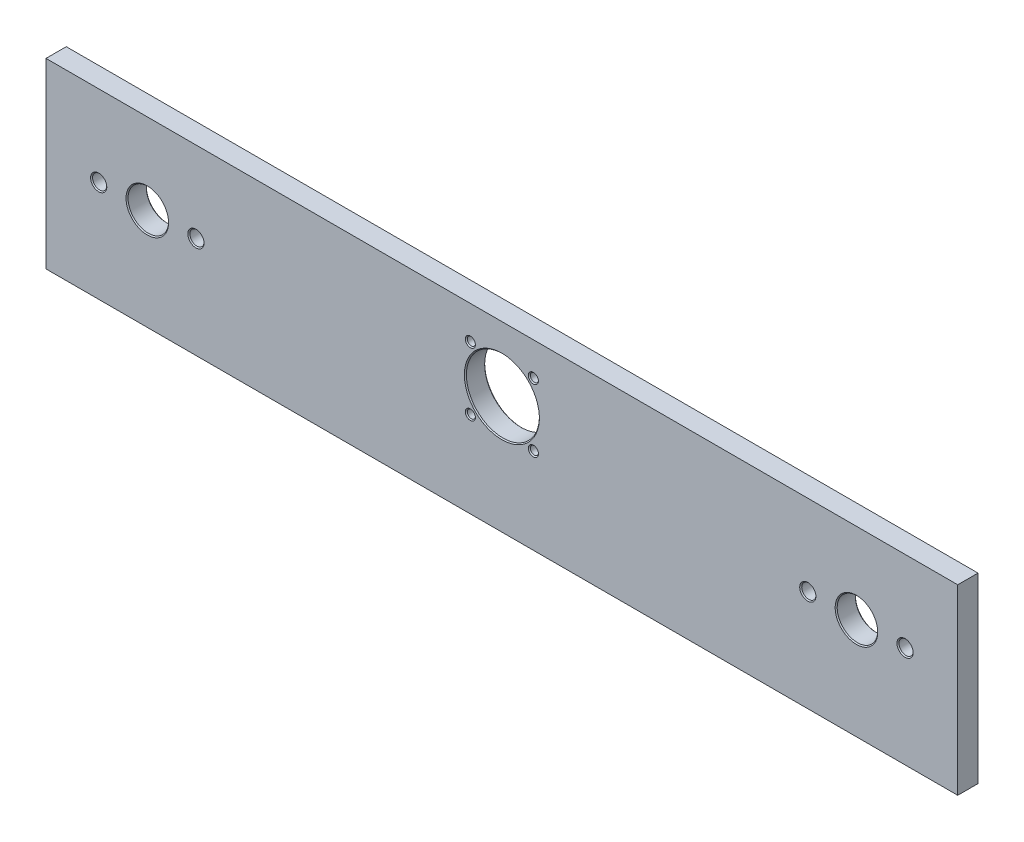
ISO-10303-21;
HEADER;
FILE_DESCRIPTION(('STEP AP214'),'2;1');
FILE_NAME('part.step','',(''),(''),'','','');
FILE_SCHEMA(('AUTOMOTIVE_DESIGN { 1 0 10303 214 1 1 1 1 }'));
ENDSEC;
DATA;
#1=APPLICATION_CONTEXT('core data for automotive mechanical design processes');
#2=APPLICATION_PROTOCOL_DEFINITION('international standard','automotive_design',2000,#1);
#3=PRODUCT_CONTEXT('',#1,'mechanical');
#4=PRODUCT('Part','Part','',(#3));
#5=PRODUCT_RELATED_PRODUCT_CATEGORY('part','',(#4));
#6=PRODUCT_DEFINITION_FORMATION('','',#4);
#7=PRODUCT_DEFINITION_CONTEXT('part definition',#1,'design');
#8=PRODUCT_DEFINITION('design','',#6,#7);
#9=PRODUCT_DEFINITION_SHAPE('','',#8);
#10=(LENGTH_UNIT() NAMED_UNIT(*) SI_UNIT(.MILLI.,.METRE.));
#11=(NAMED_UNIT(*) PLANE_ANGLE_UNIT() SI_UNIT($,.RADIAN.));
#12=(NAMED_UNIT(*) SI_UNIT($,.STERADIAN.) SOLID_ANGLE_UNIT());
#13=UNCERTAINTY_MEASURE_WITH_UNIT(LENGTH_MEASURE(1.E-05),#10,'distance_accuracy_value','');
#14=(GEOMETRIC_REPRESENTATION_CONTEXT(3) GLOBAL_UNCERTAINTY_ASSIGNED_CONTEXT((#13)) GLOBAL_UNIT_ASSIGNED_CONTEXT((#10,
#11,#12)) REPRESENTATION_CONTEXT('',''));
#15=CARTESIAN_POINT('',(0.,0.,0.));
#16=DIRECTION('',(0.,0.,1.));
#17=DIRECTION('',(1.,0.,0.));
#18=AXIS2_PLACEMENT_3D('',#15,#16,#17);
#19=CARTESIAN_POINT('',(0.,0.,10.));
#20=DIRECTION('',(1.,0.,0.));
#21=DIRECTION('',(0.,1.,0.));
#22=AXIS2_PLACEMENT_3D('',#19,#20,#21);
#23=PLANE('',#22);
#24=DIRECTION('',(0.,-1.,0.));
#25=VECTOR('',#24,1.);
#26=CARTESIAN_POINT('',(0.,0.,0.));
#27=LINE('',#26,#25);
#28=CARTESIAN_POINT('',(0.,89.9999999999999,0.));
#29=VERTEX_POINT('',#28);
#30=CARTESIAN_POINT('',(0.,0.,0.));
#31=VERTEX_POINT('',#30);
#32=EDGE_CURVE('E100',#29,#31,#27,.T.);
#33=ORIENTED_EDGE('',*,*,#32,.T.);
#34=DIRECTION('',(0.,0.,-1.));
#35=VECTOR('',#34,1.);
#36=CARTESIAN_POINT('',(0.,0.,10.));
#37=LINE('',#36,#35);
#38=CARTESIAN_POINT('',(0.,0.,10.));
#39=VERTEX_POINT('',#38);
#40=EDGE_CURVE('E91',#39,#31,#37,.T.);
#41=ORIENTED_EDGE('',*,*,#40,.F.);
#42=DIRECTION('',(0.,-1.,0.));
#43=VECTOR('',#42,1.);
#44=CARTESIAN_POINT('',(0.,0.,10.));
#45=LINE('',#44,#43);
#46=CARTESIAN_POINT('',(0.,89.9999999999999,10.));
#47=VERTEX_POINT('',#46);
#48=EDGE_CURVE('E85',#47,#39,#45,.T.);
#49=ORIENTED_EDGE('',*,*,#48,.F.);
#50=DIRECTION('',(0.,0.,-1.));
#51=VECTOR('',#50,1.);
#52=CARTESIAN_POINT('',(0.,89.9999999999999,10.));
#53=LINE('',#52,#51);
#54=EDGE_CURVE('E96',#47,#29,#53,.T.);
#55=ORIENTED_EDGE('',*,*,#54,.T.);
#56=EDGE_LOOP('',(#33,#41,#49,#55));
#57=FACE_BOUND('',#56,.T.);
#58=ADVANCED_FACE('F32',(#57),#23,.F.);
#59=CARTESIAN_POINT('',(0.,0.,10.));
#60=DIRECTION('',(0.,1.,0.));
#61=DIRECTION('',(-1.,0.,0.));
#62=AXIS2_PLACEMENT_3D('',#59,#60,#61);
#63=PLANE('',#62);
#64=DIRECTION('',(1.,0.,0.));
#65=VECTOR('',#64,1.);
#66=CARTESIAN_POINT('',(0.,0.,0.));
#67=LINE('',#66,#65);
#68=CARTESIAN_POINT('',(450.,0.,0.));
#69=VERTEX_POINT('',#68);
#70=EDGE_CURVE('E90',#31,#69,#67,.T.);
#71=ORIENTED_EDGE('',*,*,#70,.T.);
#72=DIRECTION('',(0.,0.,-1.));
#73=VECTOR('',#72,1.);
#74=CARTESIAN_POINT('',(450.,0.,10.));
#75=LINE('',#74,#73);
#76=CARTESIAN_POINT('',(450.,0.,10.));
#77=VERTEX_POINT('',#76);
#78=EDGE_CURVE('E88',#77,#69,#75,.T.);
#79=ORIENTED_EDGE('',*,*,#78,.F.);
#80=DIRECTION('',(1.,0.,0.));
#81=VECTOR('',#80,1.);
#82=CARTESIAN_POINT('',(0.,0.,10.));
#83=LINE('',#82,#81);
#84=EDGE_CURVE('E80',#39,#77,#83,.T.);
#85=ORIENTED_EDGE('',*,*,#84,.F.);
#86=ORIENTED_EDGE('',*,*,#40,.T.);
#87=EDGE_LOOP('',(#71,#79,#85,#86));
#88=FACE_BOUND('',#87,.T.);
#89=ADVANCED_FACE('F89',(#88),#63,.F.);
#90=CARTESIAN_POINT('',(450.,0.,10.));
#91=DIRECTION('',(-1.,0.,0.));
#92=DIRECTION('',(0.,-1.,0.));
#93=AXIS2_PLACEMENT_3D('',#90,#91,#92);
#94=PLANE('',#93);
#95=DIRECTION('',(0.,1.,0.));
#96=VECTOR('',#95,1.);
#97=CARTESIAN_POINT('',(450.,0.,0.));
#98=LINE('',#97,#96);
#99=CARTESIAN_POINT('',(450.,90.0000000000001,0.));
#100=VERTEX_POINT('',#99);
#101=EDGE_CURVE('E66',#69,#100,#98,.T.);
#102=ORIENTED_EDGE('',*,*,#101,.T.);
#103=DIRECTION('',(0.,0.,-1.));
#104=VECTOR('',#103,1.);
#105=CARTESIAN_POINT('',(450.,90.0000000000001,10.));
#106=LINE('',#105,#104);
#107=CARTESIAN_POINT('',(450.,90.0000000000001,10.));
#108=VERTEX_POINT('',#107);
#109=EDGE_CURVE('E92',#108,#100,#106,.T.);
#110=ORIENTED_EDGE('',*,*,#109,.F.);
#111=DIRECTION('',(0.,1.,0.));
#112=VECTOR('',#111,1.);
#113=CARTESIAN_POINT('',(450.,0.,10.));
#114=LINE('',#113,#112);
#115=EDGE_CURVE('E83',#77,#108,#114,.T.);
#116=ORIENTED_EDGE('',*,*,#115,.F.);
#117=ORIENTED_EDGE('',*,*,#78,.T.);
#118=EDGE_LOOP('',(#102,#110,#116,#117));
#119=FACE_BOUND('',#118,.T.);
#120=ADVANCED_FACE('F94',(#119),#94,.F.);
#121=CARTESIAN_POINT('',(0.,89.9999999999999,10.));
#122=DIRECTION('',(0.,-1.,0.));
#123=DIRECTION('',(1.,0.,0.));
#124=AXIS2_PLACEMENT_3D('',#121,#122,#123);
#125=PLANE('',#124);
#126=DIRECTION('',(-1.,0.,0.));
#127=VECTOR('',#126,1.);
#128=CARTESIAN_POINT('',(0.,89.9999999999999,0.));
#129=LINE('',#128,#127);
#130=EDGE_CURVE('E72',#100,#29,#129,.T.);
#131=ORIENTED_EDGE('',*,*,#130,.T.);
#132=ORIENTED_EDGE('',*,*,#54,.F.);
#133=DIRECTION('',(-1.,0.,0.));
#134=VECTOR('',#133,1.);
#135=CARTESIAN_POINT('',(0.,89.9999999999999,10.));
#136=LINE('',#135,#134);
#137=EDGE_CURVE('E49',#108,#47,#136,.T.);
#138=ORIENTED_EDGE('',*,*,#137,.F.);
#139=ORIENTED_EDGE('',*,*,#109,.T.);
#140=EDGE_LOOP('',(#131,#132,#138,#139));
#141=FACE_BOUND('',#140,.T.);
#142=ADVANCED_FACE('F361',(#141),#125,.F.);
#143=CARTESIAN_POINT('',(0.,0.,10.));
#144=DIRECTION('',(0.,0.,-1.));
#145=DIRECTION('',(-1.,0.,0.));
#146=AXIS2_PLACEMENT_3D('',#143,#144,#145);
#147=PLANE('',#146);
#148=CARTESIAN_POINT('',(424.,50.,10.));
#149=DIRECTION('',(0.,0.,-1.));
#150=DIRECTION('',(-1.,0.,0.));
#151=AXIS2_PLACEMENT_3D('',#148,#149,#150);
#152=CIRCLE('',#151,3.99999999999989);
#153=CARTESIAN_POINT('',(420.,50.,10.));
#154=VERTEX_POINT('',#153);
#155=EDGE_CURVE('E11',#154,#154,#152,.T.);
#156=ORIENTED_EDGE('',*,*,#155,.T.);
#157=EDGE_LOOP('',(#156));
#158=FACE_BOUND('',#157,.T.);
#159=CARTESIAN_POINT('',(400.,50.,10.));
#160=DIRECTION('',(0.,0.,-1.));
#161=DIRECTION('',(-1.,0.,0.));
#162=AXIS2_PLACEMENT_3D('',#159,#160,#161);
#163=CIRCLE('',#162,10.5000000000001);
#164=CARTESIAN_POINT('',(389.5,50.,10.));
#165=VERTEX_POINT('',#164);
#166=EDGE_CURVE('E41',#165,#165,#163,.T.);
#167=ORIENTED_EDGE('',*,*,#166,.T.);
#168=EDGE_LOOP('',(#167));
#169=FACE_BOUND('',#168,.T.);
#170=CARTESIAN_POINT('',(376.,50.,10.));
#171=DIRECTION('',(0.,0.,-1.));
#172=DIRECTION('',(-1.,0.,0.));
#173=AXIS2_PLACEMENT_3D('',#170,#171,#172);
#174=CIRCLE('',#173,3.99999999999989);
#175=CARTESIAN_POINT('',(372.,50.,10.));
#176=VERTEX_POINT('',#175);
#177=EDGE_CURVE('E232',#176,#176,#174,.T.);
#178=ORIENTED_EDGE('',*,*,#177,.T.);
#179=EDGE_LOOP('',(#178));
#180=FACE_BOUND('',#179,.T.);
#181=CARTESIAN_POINT('',(74.,49.9999999999999,10.));
#182=DIRECTION('',(0.,0.,-1.));
#183=DIRECTION('',(-1.,0.,0.));
#184=AXIS2_PLACEMENT_3D('',#181,#182,#183);
#185=CIRCLE('',#184,4.00000000000006);
#186=CARTESIAN_POINT('',(70.,49.9999999999999,10.));
#187=VERTEX_POINT('',#186);
#188=EDGE_CURVE('E229',#187,#187,#185,.T.);
#189=ORIENTED_EDGE('',*,*,#188,.T.);
#190=EDGE_LOOP('',(#189));
#191=FACE_BOUND('',#190,.T.);
#192=CARTESIAN_POINT('',(50.,49.9999999999999,10.));
#193=DIRECTION('',(0.,0.,-1.));
#194=DIRECTION('',(-1.,0.,0.));
#195=AXIS2_PLACEMENT_3D('',#192,#193,#194);
#196=CIRCLE('',#195,10.5000000000001);
#197=CARTESIAN_POINT('',(39.5,49.9999999999999,10.));
#198=VERTEX_POINT('',#197);
#199=EDGE_CURVE('E226',#198,#198,#196,.T.);
#200=ORIENTED_EDGE('',*,*,#199,.T.);
#201=EDGE_LOOP('',(#200));
#202=FACE_BOUND('',#201,.T.);
#203=CARTESIAN_POINT('',(26.,49.9999999999999,10.));
#204=DIRECTION('',(0.,0.,-1.));
#205=DIRECTION('',(-1.,0.,0.));
#206=AXIS2_PLACEMENT_3D('',#203,#204,#205);
#207=CIRCLE('',#206,4.00000000000006);
#208=CARTESIAN_POINT('',(22.,49.9999999999999,10.));
#209=VERTEX_POINT('',#208);
#210=EDGE_CURVE('E223',#209,#209,#207,.T.);
#211=ORIENTED_EDGE('',*,*,#210,.T.);
#212=EDGE_LOOP('',(#211));
#213=FACE_BOUND('',#212,.T.);
#214=CARTESIAN_POINT('',(240.562232823002,42.4495366769125,10.));
#215=DIRECTION('',(0.,0.,-1.));
#216=DIRECTION('',(-1.,0.,0.));
#217=AXIS2_PLACEMENT_3D('',#214,#215,#216);
#218=CIRCLE('',#217,2.5);
#219=CARTESIAN_POINT('',(238.062232823002,42.4495366769125,10.));
#220=VERTEX_POINT('',#219);
#221=EDGE_CURVE('E160',#220,#220,#218,.T.);
#222=ORIENTED_EDGE('',*,*,#221,.T.);
#223=EDGE_LOOP('',(#222));
#224=FACE_BOUND('',#223,.T.);
#225=CARTESIAN_POINT('',(209.449536676913,42.4377671769982,10.));
#226=DIRECTION('',(0.,0.,-1.));
#227=DIRECTION('',(-1.,0.,0.));
#228=AXIS2_PLACEMENT_3D('',#225,#226,#227);
#229=CIRCLE('',#228,2.5);
#230=CARTESIAN_POINT('',(206.949536676913,42.4377671769982,10.));
#231=VERTEX_POINT('',#230);
#232=EDGE_CURVE('E157',#231,#231,#229,.T.);
#233=ORIENTED_EDGE('',*,*,#232,.T.);
#234=EDGE_LOOP('',(#233));
#235=FACE_BOUND('',#234,.T.);
#236=CARTESIAN_POINT('',(240.550463323087,73.5622328230016,10.));
#237=DIRECTION('',(0.,0.,-1.));
#238=DIRECTION('',(-1.,0.,0.));
#239=AXIS2_PLACEMENT_3D('',#236,#237,#238);
#240=CIRCLE('',#239,2.5);
#241=CARTESIAN_POINT('',(238.050463323087,73.5622328230016,10.));
#242=VERTEX_POINT('',#241);
#243=EDGE_CURVE('E154',#242,#242,#240,.T.);
#244=ORIENTED_EDGE('',*,*,#243,.T.);
#245=EDGE_LOOP('',(#244));
#246=FACE_BOUND('',#245,.T.);
#247=CARTESIAN_POINT('',(209.437767176998,73.5504633230874,10.));
#248=DIRECTION('',(0.,0.,-1.));
#249=DIRECTION('',(-1.,0.,0.));
#250=AXIS2_PLACEMENT_3D('',#247,#248,#249);
#251=CIRCLE('',#250,2.5);
#252=CARTESIAN_POINT('',(206.937767176998,73.5504633230874,10.));
#253=VERTEX_POINT('',#252);
#254=EDGE_CURVE('E151',#253,#253,#251,.T.);
#255=ORIENTED_EDGE('',*,*,#254,.T.);
#256=EDGE_LOOP('',(#255));
#257=FACE_BOUND('',#256,.T.);
#258=CARTESIAN_POINT('',(225.,57.9999999999999,10.));
#259=DIRECTION('',(0.,0.,-1.));
#260=DIRECTION('',(-1.,0.,0.));
#261=AXIS2_PLACEMENT_3D('',#258,#259,#260);
#262=CIRCLE('',#261,18.5000000000001);
#263=CARTESIAN_POINT('',(206.5,57.9999999999999,10.));
#264=VERTEX_POINT('',#263);
#265=EDGE_CURVE('E148',#264,#264,#262,.T.);
#266=ORIENTED_EDGE('',*,*,#265,.T.);
#267=EDGE_LOOP('',(#266));
#268=FACE_BOUND('',#267,.T.);
#269=ORIENTED_EDGE('',*,*,#48,.T.);
#270=ORIENTED_EDGE('',*,*,#84,.T.);
#271=ORIENTED_EDGE('',*,*,#115,.T.);
#272=ORIENTED_EDGE('',*,*,#137,.T.);
#273=EDGE_LOOP('',(#269,#270,#271,#272));
#274=FACE_BOUND('',#273,.T.);
#275=ADVANCED_FACE('F81',(#158,#169,#180,#191,#202,#213,#224,#235,#246,#257,#268,#274),#147,.F.);
#276=CARTESIAN_POINT('',(0.,0.,0.));
#277=DIRECTION('',(0.,0.,-1.));
#278=DIRECTION('',(-1.,0.,0.));
#279=AXIS2_PLACEMENT_3D('',#276,#277,#278);
#280=PLANE('',#279);
#281=CARTESIAN_POINT('',(26.,49.9999999999999,0.));
#282=DIRECTION('',(0.,0.,-1.));
#283=DIRECTION('',(-1.,0.,0.));
#284=AXIS2_PLACEMENT_3D('',#281,#282,#283);
#285=CIRCLE('',#284,3.99999999999989);
#286=CARTESIAN_POINT('',(22.0000000000001,49.9999999999999,0.));
#287=VERTEX_POINT('',#286);
#288=EDGE_CURVE('E184',#287,#287,#285,.F.);
#289=ORIENTED_EDGE('',*,*,#288,.T.);
#290=EDGE_LOOP('',(#289));
#291=FACE_BOUND('',#290,.T.);
#292=CARTESIAN_POINT('',(50.,49.9999999999999,0.));
#293=DIRECTION('',(0.,0.,-1.));
#294=DIRECTION('',(-1.,0.,0.));
#295=AXIS2_PLACEMENT_3D('',#292,#293,#294);
#296=CIRCLE('',#295,10.5);
#297=CARTESIAN_POINT('',(39.5,49.9999999999999,0.));
#298=VERTEX_POINT('',#297);
#299=EDGE_CURVE('E181',#298,#298,#296,.F.);
#300=ORIENTED_EDGE('',*,*,#299,.T.);
#301=EDGE_LOOP('',(#300));
#302=FACE_BOUND('',#301,.T.);
#303=CARTESIAN_POINT('',(74.,49.9999999999999,0.));
#304=DIRECTION('',(0.,0.,-1.));
#305=DIRECTION('',(-1.,0.,0.));
#306=AXIS2_PLACEMENT_3D('',#303,#304,#305);
#307=CIRCLE('',#306,4.00000000000006);
#308=CARTESIAN_POINT('',(70.,49.9999999999999,0.));
#309=VERTEX_POINT('',#308);
#310=EDGE_CURVE('E178',#309,#309,#307,.F.);
#311=ORIENTED_EDGE('',*,*,#310,.T.);
#312=EDGE_LOOP('',(#311));
#313=FACE_BOUND('',#312,.T.);
#314=CARTESIAN_POINT('',(376.,50.,0.));
#315=DIRECTION('',(0.,0.,-1.));
#316=DIRECTION('',(-1.,0.,0.));
#317=AXIS2_PLACEMENT_3D('',#314,#315,#316);
#318=CIRCLE('',#317,4.00000000000006);
#319=CARTESIAN_POINT('',(372.,50.,0.));
#320=VERTEX_POINT('',#319);
#321=EDGE_CURVE('E175',#320,#320,#318,.F.);
#322=ORIENTED_EDGE('',*,*,#321,.T.);
#323=EDGE_LOOP('',(#322));
#324=FACE_BOUND('',#323,.T.);
#325=CARTESIAN_POINT('',(400.,50.,0.));
#326=DIRECTION('',(0.,0.,-1.));
#327=DIRECTION('',(-1.,0.,0.));
#328=AXIS2_PLACEMENT_3D('',#325,#326,#327);
#329=CIRCLE('',#328,10.5000000000001);
#330=CARTESIAN_POINT('',(389.5,50.,0.));
#331=VERTEX_POINT('',#330);
#332=EDGE_CURVE('E172',#331,#331,#329,.F.);
#333=ORIENTED_EDGE('',*,*,#332,.T.);
#334=EDGE_LOOP('',(#333));
#335=FACE_BOUND('',#334,.T.);
#336=CARTESIAN_POINT('',(424.,50.,0.));
#337=DIRECTION('',(0.,0.,-1.));
#338=DIRECTION('',(-1.,0.,0.));
#339=AXIS2_PLACEMENT_3D('',#336,#337,#338);
#340=CIRCLE('',#339,4.00000000000006);
#341=CARTESIAN_POINT('',(420.,50.,0.));
#342=VERTEX_POINT('',#341);
#343=EDGE_CURVE('E169',#342,#342,#340,.F.);
#344=ORIENTED_EDGE('',*,*,#343,.T.);
#345=EDGE_LOOP('',(#344));
#346=FACE_BOUND('',#345,.T.);
#347=CARTESIAN_POINT('',(209.449536676913,42.4377671769982,0.));
#348=DIRECTION('',(0.,0.,-1.));
#349=DIRECTION('',(-1.,0.,0.));
#350=AXIS2_PLACEMENT_3D('',#347,#348,#349);
#351=CIRCLE('',#350,2.50000000000006);
#352=CARTESIAN_POINT('',(206.949536676912,42.4377671769982,0.));
#353=VERTEX_POINT('',#352);
#354=EDGE_CURVE('E121',#353,#353,#351,.F.);
#355=ORIENTED_EDGE('',*,*,#354,.T.);
#356=EDGE_LOOP('',(#355));
#357=FACE_BOUND('',#356,.T.);
#358=CARTESIAN_POINT('',(240.562232823002,42.4495366769125,0.));
#359=DIRECTION('',(0.,0.,-1.));
#360=DIRECTION('',(-1.,0.,0.));
#361=AXIS2_PLACEMENT_3D('',#358,#359,#360);
#362=CIRCLE('',#361,2.50000000000006);
#363=CARTESIAN_POINT('',(238.062232823002,42.4495366769125,0.));
#364=VERTEX_POINT('',#363);
#365=EDGE_CURVE('E118',#364,#364,#362,.F.);
#366=ORIENTED_EDGE('',*,*,#365,.T.);
#367=EDGE_LOOP('',(#366));
#368=FACE_BOUND('',#367,.T.);
#369=CARTESIAN_POINT('',(209.437767176998,73.5504633230874,0.));
#370=DIRECTION('',(0.,0.,-1.));
#371=DIRECTION('',(-1.,0.,0.));
#372=AXIS2_PLACEMENT_3D('',#369,#370,#371);
#373=CIRCLE('',#372,2.50000000000006);
#374=CARTESIAN_POINT('',(206.937767176998,73.5504633230874,0.));
#375=VERTEX_POINT('',#374);
#376=EDGE_CURVE('E115',#375,#375,#373,.F.);
#377=ORIENTED_EDGE('',*,*,#376,.T.);
#378=EDGE_LOOP('',(#377));
#379=FACE_BOUND('',#378,.T.);
#380=CARTESIAN_POINT('',(240.550463323087,73.5622328230016,0.));
#381=DIRECTION('',(0.,0.,-1.));
#382=DIRECTION('',(-1.,0.,0.));
#383=AXIS2_PLACEMENT_3D('',#380,#381,#382);
#384=CIRCLE('',#383,2.50000000000006);
#385=CARTESIAN_POINT('',(238.050463323087,73.5622328230016,0.));
#386=VERTEX_POINT('',#385);
#387=EDGE_CURVE('E112',#386,#386,#384,.F.);
#388=ORIENTED_EDGE('',*,*,#387,.T.);
#389=EDGE_LOOP('',(#388));
#390=FACE_BOUND('',#389,.T.);
#391=CARTESIAN_POINT('',(225.,57.9999999999999,0.));
#392=DIRECTION('',(0.,0.,-1.));
#393=DIRECTION('',(-1.,0.,0.));
#394=AXIS2_PLACEMENT_3D('',#391,#392,#393);
#395=CIRCLE('',#394,18.5);
#396=CARTESIAN_POINT('',(206.5,57.9999999999999,0.));
#397=VERTEX_POINT('',#396);
#398=EDGE_CURVE('E109',#397,#397,#395,.F.);
#399=ORIENTED_EDGE('',*,*,#398,.T.);
#400=EDGE_LOOP('',(#399));
#401=FACE_BOUND('',#400,.T.);
#402=ORIENTED_EDGE('',*,*,#32,.F.);
#403=ORIENTED_EDGE('',*,*,#130,.F.);
#404=ORIENTED_EDGE('',*,*,#101,.F.);
#405=ORIENTED_EDGE('',*,*,#70,.F.);
#406=EDGE_LOOP('',(#402,#403,#404,#405));
#407=FACE_BOUND('',#406,.T.);
#408=ADVANCED_FACE('F360',(#291,#302,#313,#324,#335,#346,#357,#368,#379,#390,#401,#407),#280,.T.);
#409=CARTESIAN_POINT('',(225.,57.9999999999999,0.));
#410=DIRECTION('',(0.,0.,1.));
#411=DIRECTION('',(1.,0.,0.));
#412=AXIS2_PLACEMENT_3D('',#409,#410,#411);
#413=CYLINDRICAL_SURFACE('',#412,18.);
#414=CARTESIAN_POINT('',(225.,57.9999999999999,9.49999999999991));
#415=DIRECTION('',(0.,0.,-1.));
#416=DIRECTION('',(-1.,0.,0.));
#417=AXIS2_PLACEMENT_3D('',#414,#415,#416);
#418=CIRCLE('',#417,18.);
#419=CARTESIAN_POINT('',(207.,57.9999999999999,9.49999999999991));
#420=VERTEX_POINT('',#419);
#421=EDGE_CURVE('E166',#420,#420,#418,.F.);
#422=ORIENTED_EDGE('',*,*,#421,.T.);
#423=EDGE_LOOP('',(#422));
#424=FACE_BOUND('',#423,.T.);
#425=CARTESIAN_POINT('',(225.,57.9999999999999,0.499999999999976));
#426=DIRECTION('',(0.,0.,-1.));
#427=DIRECTION('',(-1.,0.,0.));
#428=AXIS2_PLACEMENT_3D('',#425,#426,#427);
#429=CIRCLE('',#428,18.);
#430=CARTESIAN_POINT('',(207.,57.9999999999999,0.499999999999976));
#431=VERTEX_POINT('',#430);
#432=EDGE_CURVE('E163',#431,#431,#429,.T.);
#433=ORIENTED_EDGE('',*,*,#432,.T.);
#434=EDGE_LOOP('',(#433));
#435=FACE_BOUND('',#434,.T.);
#436=ADVANCED_FACE('F378',(#424,#435),#413,.F.);
#437=CARTESIAN_POINT('',(209.437767176998,73.5504633230874,0.));
#438=DIRECTION('',(0.,0.,1.));
#439=DIRECTION('',(1.,0.,0.));
#440=AXIS2_PLACEMENT_3D('',#437,#438,#439);
#441=CYLINDRICAL_SURFACE('',#440,2.);
#442=CARTESIAN_POINT('',(209.437767176998,73.5504633230874,0.500000000000013));
#443=DIRECTION('',(0.,0.,-1.));
#444=DIRECTION('',(-1.,0.,0.));
#445=AXIS2_PLACEMENT_3D('',#442,#443,#444);
#446=CIRCLE('',#445,2.);
#447=CARTESIAN_POINT('',(207.437767176998,73.5504633230874,0.500000000000013));
#448=VERTEX_POINT('',#447);
#449=EDGE_CURVE('E139',#448,#448,#446,.T.);
#450=ORIENTED_EDGE('',*,*,#449,.T.);
#451=EDGE_LOOP('',(#450));
#452=FACE_BOUND('',#451,.T.);
#453=CARTESIAN_POINT('',(209.437767176998,73.5504633230874,9.50000000000004));
#454=DIRECTION('',(0.,0.,-1.));
#455=DIRECTION('',(-1.,0.,0.));
#456=AXIS2_PLACEMENT_3D('',#453,#454,#455);
#457=CIRCLE('',#456,2.);
#458=CARTESIAN_POINT('',(207.437767176998,73.5504633230874,9.50000000000004));
#459=VERTEX_POINT('',#458);
#460=EDGE_CURVE('E136',#459,#459,#457,.F.);
#461=ORIENTED_EDGE('',*,*,#460,.T.);
#462=EDGE_LOOP('',(#461));
#463=FACE_BOUND('',#462,.T.);
#464=ADVANCED_FACE('F381',(#452,#463),#441,.F.);
#465=CARTESIAN_POINT('',(240.550463323087,73.5622328230016,0.));
#466=DIRECTION('',(0.,0.,1.));
#467=DIRECTION('',(1.,0.,0.));
#468=AXIS2_PLACEMENT_3D('',#465,#466,#467);
#469=CYLINDRICAL_SURFACE('',#468,2.);
#470=CARTESIAN_POINT('',(240.550463323087,73.5622328230016,0.500000000000013));
#471=DIRECTION('',(0.,0.,-1.));
#472=DIRECTION('',(-1.,0.,0.));
#473=AXIS2_PLACEMENT_3D('',#470,#471,#472);
#474=CIRCLE('',#473,2.);
#475=CARTESIAN_POINT('',(238.550463323087,73.5622328230016,0.500000000000013));
#476=VERTEX_POINT('',#475);
#477=EDGE_CURVE('E145',#476,#476,#474,.T.);
#478=ORIENTED_EDGE('',*,*,#477,.T.);
#479=EDGE_LOOP('',(#478));
#480=FACE_BOUND('',#479,.T.);
#481=CARTESIAN_POINT('',(240.550463323087,73.5622328230016,9.50000000000004));
#482=DIRECTION('',(0.,0.,-1.));
#483=DIRECTION('',(-1.,0.,0.));
#484=AXIS2_PLACEMENT_3D('',#481,#482,#483);
#485=CIRCLE('',#484,2.);
#486=CARTESIAN_POINT('',(238.550463323087,73.5622328230016,9.50000000000004));
#487=VERTEX_POINT('',#486);
#488=EDGE_CURVE('E142',#487,#487,#485,.F.);
#489=ORIENTED_EDGE('',*,*,#488,.T.);
#490=EDGE_LOOP('',(#489));
#491=FACE_BOUND('',#490,.T.);
#492=ADVANCED_FACE('F400',(#480,#491),#469,.F.);
#493=CARTESIAN_POINT('',(240.562232823002,42.4495366769125,0.));
#494=DIRECTION('',(0.,0.,1.));
#495=DIRECTION('',(1.,0.,0.));
#496=AXIS2_PLACEMENT_3D('',#493,#494,#495);
#497=CYLINDRICAL_SURFACE('',#496,2.);
#498=CARTESIAN_POINT('',(240.562232823002,42.4495366769125,0.500000000000013));
#499=DIRECTION('',(0.,0.,-1.));
#500=DIRECTION('',(-1.,0.,0.));
#501=AXIS2_PLACEMENT_3D('',#498,#499,#500);
#502=CIRCLE('',#501,2.);
#503=CARTESIAN_POINT('',(238.562232823002,42.4495366769125,0.500000000000013));
#504=VERTEX_POINT('',#503);
#505=EDGE_CURVE('E133',#504,#504,#502,.T.);
#506=ORIENTED_EDGE('',*,*,#505,.T.);
#507=EDGE_LOOP('',(#506));
#508=FACE_BOUND('',#507,.T.);
#509=CARTESIAN_POINT('',(240.562232823002,42.4495366769125,9.50000000000004));
#510=DIRECTION('',(0.,0.,-1.));
#511=DIRECTION('',(-1.,0.,0.));
#512=AXIS2_PLACEMENT_3D('',#509,#510,#511);
#513=CIRCLE('',#512,2.);
#514=CARTESIAN_POINT('',(238.562232823002,42.4495366769125,9.50000000000004));
#515=VERTEX_POINT('',#514);
#516=EDGE_CURVE('E130',#515,#515,#513,.F.);
#517=ORIENTED_EDGE('',*,*,#516,.T.);
#518=EDGE_LOOP('',(#517));
#519=FACE_BOUND('',#518,.T.);
#520=ADVANCED_FACE('F404',(#508,#519),#497,.F.);
#521=CARTESIAN_POINT('',(209.449536676913,42.4377671769982,0.));
#522=DIRECTION('',(0.,0.,1.));
#523=DIRECTION('',(1.,0.,0.));
#524=AXIS2_PLACEMENT_3D('',#521,#522,#523);
#525=CYLINDRICAL_SURFACE('',#524,2.00000000000003);
#526=CARTESIAN_POINT('',(209.449536676913,42.4377671769982,0.499999999999984));
#527=DIRECTION('',(0.,0.,-1.));
#528=DIRECTION('',(-1.,0.,0.));
#529=AXIS2_PLACEMENT_3D('',#526,#527,#528);
#530=CIRCLE('',#529,2.00000000000003);
#531=CARTESIAN_POINT('',(207.449536676913,42.4377671769982,0.499999999999984));
#532=VERTEX_POINT('',#531);
#533=EDGE_CURVE('E127',#532,#532,#530,.T.);
#534=ORIENTED_EDGE('',*,*,#533,.T.);
#535=EDGE_LOOP('',(#534));
#536=FACE_BOUND('',#535,.T.);
#537=CARTESIAN_POINT('',(209.449536676913,42.4377671769982,9.50000000000007));
#538=DIRECTION('',(0.,0.,-1.));
#539=DIRECTION('',(-1.,0.,0.));
#540=AXIS2_PLACEMENT_3D('',#537,#538,#539);
#541=CIRCLE('',#540,2.00000000000003);
#542=CARTESIAN_POINT('',(207.449536676913,42.4377671769982,9.50000000000007));
#543=VERTEX_POINT('',#542);
#544=EDGE_CURVE('E124',#543,#543,#541,.F.);
#545=ORIENTED_EDGE('',*,*,#544,.T.);
#546=EDGE_LOOP('',(#545));
#547=FACE_BOUND('',#546,.T.);
#548=ADVANCED_FACE('F276',(#536,#547),#525,.F.);
#549=CARTESIAN_POINT('',(209.449536676913,42.4377671769982,0.));
#550=DIRECTION('',(0.,0.,-1.));
#551=DIRECTION('',(-1.,0.,0.));
#552=AXIS2_PLACEMENT_3D('',#549,#550,#551);
#553=CONICAL_SURFACE('',#552,2.50000000000006,0.785398163397497);
#554=ORIENTED_EDGE('',*,*,#533,.F.);
#555=EDGE_LOOP('',(#554));
#556=FACE_BOUND('',#555,.T.);
#557=ORIENTED_EDGE('',*,*,#354,.F.);
#558=EDGE_LOOP('',(#557));
#559=FACE_BOUND('',#558,.T.);
#560=ADVANCED_FACE('F272',(#556,#559),#553,.F.);
#561=CARTESIAN_POINT('',(240.562232823002,42.4495366769125,0.));
#562=DIRECTION('',(0.,0.,-1.));
#563=DIRECTION('',(-1.,0.,0.));
#564=AXIS2_PLACEMENT_3D('',#561,#562,#563);
#565=CONICAL_SURFACE('',#564,2.50000000000006,0.785398163397497);
#566=ORIENTED_EDGE('',*,*,#505,.F.);
#567=EDGE_LOOP('',(#566));
#568=FACE_BOUND('',#567,.T.);
#569=ORIENTED_EDGE('',*,*,#365,.F.);
#570=EDGE_LOOP('',(#569));
#571=FACE_BOUND('',#570,.T.);
#572=ADVANCED_FACE('F275',(#568,#571),#565,.F.);
#573=CARTESIAN_POINT('',(209.437767176998,73.5504633230874,0.));
#574=DIRECTION('',(0.,0.,-1.));
#575=DIRECTION('',(-1.,0.,0.));
#576=AXIS2_PLACEMENT_3D('',#573,#574,#575);
#577=CONICAL_SURFACE('',#576,2.50000000000006,0.785398163397497);
#578=ORIENTED_EDGE('',*,*,#449,.F.);
#579=EDGE_LOOP('',(#578));
#580=FACE_BOUND('',#579,.T.);
#581=ORIENTED_EDGE('',*,*,#376,.F.);
#582=EDGE_LOOP('',(#581));
#583=FACE_BOUND('',#582,.T.);
#584=ADVANCED_FACE('F280',(#580,#583),#577,.F.);
#585=CARTESIAN_POINT('',(240.550463323087,73.5622328230016,0.));
#586=DIRECTION('',(0.,0.,-1.));
#587=DIRECTION('',(-1.,0.,0.));
#588=AXIS2_PLACEMENT_3D('',#585,#586,#587);
#589=CONICAL_SURFACE('',#588,2.50000000000006,0.785398163397497);
#590=ORIENTED_EDGE('',*,*,#477,.F.);
#591=EDGE_LOOP('',(#590));
#592=FACE_BOUND('',#591,.T.);
#593=ORIENTED_EDGE('',*,*,#387,.F.);
#594=EDGE_LOOP('',(#593));
#595=FACE_BOUND('',#594,.T.);
#596=ADVANCED_FACE('F284',(#592,#595),#589,.F.);
#597=CARTESIAN_POINT('',(240.562232823002,42.4495366769125,9.50000000000004));
#598=DIRECTION('',(0.,0.,1.));
#599=DIRECTION('',(1.,0.,0.));
#600=AXIS2_PLACEMENT_3D('',#597,#598,#599);
#601=CONICAL_SURFACE('',#600,2.,0.785398163397497);
#602=ORIENTED_EDGE('',*,*,#221,.F.);
#603=EDGE_LOOP('',(#602));
#604=FACE_BOUND('',#603,.T.);
#605=ORIENTED_EDGE('',*,*,#516,.F.);
#606=EDGE_LOOP('',(#605));
#607=FACE_BOUND('',#606,.T.);
#608=ADVANCED_FACE('F288',(#604,#607),#601,.F.);
#609=CARTESIAN_POINT('',(209.449536676913,42.4377671769982,9.50000000000007));
#610=DIRECTION('',(0.,0.,1.));
#611=DIRECTION('',(1.,0.,0.));
#612=AXIS2_PLACEMENT_3D('',#609,#610,#611);
#613=CONICAL_SURFACE('',#612,2.00000000000003,0.785398163397498);
#614=ORIENTED_EDGE('',*,*,#232,.F.);
#615=EDGE_LOOP('',(#614));
#616=FACE_BOUND('',#615,.T.);
#617=ORIENTED_EDGE('',*,*,#544,.F.);
#618=EDGE_LOOP('',(#617));
#619=FACE_BOUND('',#618,.T.);
#620=ADVANCED_FACE('F292',(#616,#619),#613,.F.);
#621=CARTESIAN_POINT('',(240.550463323087,73.5622328230016,9.50000000000004));
#622=DIRECTION('',(0.,0.,1.));
#623=DIRECTION('',(1.,0.,0.));
#624=AXIS2_PLACEMENT_3D('',#621,#622,#623);
#625=CONICAL_SURFACE('',#624,2.,0.785398163397497);
#626=ORIENTED_EDGE('',*,*,#243,.F.);
#627=EDGE_LOOP('',(#626));
#628=FACE_BOUND('',#627,.T.);
#629=ORIENTED_EDGE('',*,*,#488,.F.);
#630=EDGE_LOOP('',(#629));
#631=FACE_BOUND('',#630,.T.);
#632=ADVANCED_FACE('F296',(#628,#631),#625,.F.);
#633=CARTESIAN_POINT('',(209.437767176998,73.5504633230874,9.50000000000004));
#634=DIRECTION('',(0.,0.,1.));
#635=DIRECTION('',(1.,0.,0.));
#636=AXIS2_PLACEMENT_3D('',#633,#634,#635);
#637=CONICAL_SURFACE('',#636,2.,0.785398163397497);
#638=ORIENTED_EDGE('',*,*,#254,.F.);
#639=EDGE_LOOP('',(#638));
#640=FACE_BOUND('',#639,.T.);
#641=ORIENTED_EDGE('',*,*,#460,.F.);
#642=EDGE_LOOP('',(#641));
#643=FACE_BOUND('',#642,.T.);
#644=ADVANCED_FACE('F300',(#640,#643),#637,.F.);
#645=CARTESIAN_POINT('',(225.,57.9999999999999,9.49999999999991));
#646=DIRECTION('',(0.,0.,1.));
#647=DIRECTION('',(1.,0.,0.));
#648=AXIS2_PLACEMENT_3D('',#645,#646,#647);
#649=CONICAL_SURFACE('',#648,18.,0.785398163397441);
#650=ORIENTED_EDGE('',*,*,#265,.F.);
#651=EDGE_LOOP('',(#650));
#652=FACE_BOUND('',#651,.T.);
#653=ORIENTED_EDGE('',*,*,#421,.F.);
#654=EDGE_LOOP('',(#653));
#655=FACE_BOUND('',#654,.T.);
#656=ADVANCED_FACE('F304',(#652,#655),#649,.F.);
#657=CARTESIAN_POINT('',(225.,57.9999999999999,0.));
#658=DIRECTION('',(0.,0.,-1.));
#659=DIRECTION('',(-1.,0.,0.));
#660=AXIS2_PLACEMENT_3D('',#657,#658,#659);
#661=CONICAL_SURFACE('',#660,18.5,0.785398163397497);
#662=ORIENTED_EDGE('',*,*,#432,.F.);
#663=EDGE_LOOP('',(#662));
#664=FACE_BOUND('',#663,.T.);
#665=ORIENTED_EDGE('',*,*,#398,.F.);
#666=EDGE_LOOP('',(#665));
#667=FACE_BOUND('',#666,.T.);
#668=ADVANCED_FACE('F260',(#664,#667),#661,.F.);
#669=CARTESIAN_POINT('',(50.,49.9999999999999,0.));
#670=DIRECTION('',(0.,0.,1.));
#671=DIRECTION('',(1.,0.,0.));
#672=AXIS2_PLACEMENT_3D('',#669,#670,#671);
#673=CYLINDRICAL_SURFACE('',#672,10.);
#674=CARTESIAN_POINT('',(50.,49.9999999999999,0.499999999999987));
#675=DIRECTION('',(0.,0.,-1.));
#676=DIRECTION('',(-1.,0.,0.));
#677=AXIS2_PLACEMENT_3D('',#674,#675,#676);
#678=CIRCLE('',#677,10.);
#679=CARTESIAN_POINT('',(40.,49.9999999999999,0.499999999999987));
#680=VERTEX_POINT('',#679);
#681=EDGE_CURVE('E196',#680,#680,#678,.T.);
#682=ORIENTED_EDGE('',*,*,#681,.T.);
#683=EDGE_LOOP('',(#682));
#684=FACE_BOUND('',#683,.T.);
#685=CARTESIAN_POINT('',(50.,49.9999999999999,9.49999999999996));
#686=DIRECTION('',(0.,0.,-1.));
#687=DIRECTION('',(-1.,0.,0.));
#688=AXIS2_PLACEMENT_3D('',#685,#686,#687);
#689=CIRCLE('',#688,10.);
#690=CARTESIAN_POINT('',(40.,49.9999999999999,9.49999999999996));
#691=VERTEX_POINT('',#690);
#692=EDGE_CURVE('E193',#691,#691,#689,.F.);
#693=ORIENTED_EDGE('',*,*,#692,.T.);
#694=EDGE_LOOP('',(#693));
#695=FACE_BOUND('',#694,.T.);
#696=ADVANCED_FACE('F250',(#684,#695),#673,.F.);
#697=CARTESIAN_POINT('',(400.,50.,0.));
#698=DIRECTION('',(0.,0.,1.));
#699=DIRECTION('',(1.,0.,0.));
#700=AXIS2_PLACEMENT_3D('',#697,#698,#699);
#701=CYLINDRICAL_SURFACE('',#700,9.99999999999998);
#702=CARTESIAN_POINT('',(400.,50.,0.500000000000007));
#703=DIRECTION('',(0.,0.,-1.));
#704=DIRECTION('',(-1.,0.,0.));
#705=AXIS2_PLACEMENT_3D('',#702,#703,#704);
#706=CIRCLE('',#705,9.99999999999998);
#707=CARTESIAN_POINT('',(390.,50.,0.500000000000007));
#708=VERTEX_POINT('',#707);
#709=EDGE_CURVE('E214',#708,#708,#706,.T.);
#710=ORIENTED_EDGE('',*,*,#709,.T.);
#711=EDGE_LOOP('',(#710));
#712=FACE_BOUND('',#711,.T.);
#713=CARTESIAN_POINT('',(400.,50.,9.49999999999994));
#714=DIRECTION('',(0.,0.,-1.));
#715=DIRECTION('',(-1.,0.,0.));
#716=AXIS2_PLACEMENT_3D('',#713,#714,#715);
#717=CIRCLE('',#716,9.99999999999998);
#718=CARTESIAN_POINT('',(390.,50.,9.49999999999994));
#719=VERTEX_POINT('',#718);
#720=EDGE_CURVE('E211',#719,#719,#717,.F.);
#721=ORIENTED_EDGE('',*,*,#720,.T.);
#722=EDGE_LOOP('',(#721));
#723=FACE_BOUND('',#722,.T.);
#724=ADVANCED_FACE('F247',(#712,#723),#701,.F.);
#725=CARTESIAN_POINT('',(26.,49.9999999999999,0.));
#726=DIRECTION('',(0.,0.,1.));
#727=DIRECTION('',(1.,0.,0.));
#728=AXIS2_PLACEMENT_3D('',#725,#726,#727);
#729=CYLINDRICAL_SURFACE('',#728,3.5);
#730=CARTESIAN_POINT('',(26.,49.9999999999999,0.499999999999911));
#731=DIRECTION('',(0.,0.,-1.));
#732=DIRECTION('',(-1.,0.,0.));
#733=AXIS2_PLACEMENT_3D('',#730,#731,#732);
#734=CIRCLE('',#733,3.5);
#735=CARTESIAN_POINT('',(22.5,49.9999999999999,0.499999999999911));
#736=VERTEX_POINT('',#735);
#737=EDGE_CURVE('E190',#736,#736,#734,.T.);
#738=ORIENTED_EDGE('',*,*,#737,.T.);
#739=EDGE_LOOP('',(#738));
#740=FACE_BOUND('',#739,.T.);
#741=CARTESIAN_POINT('',(26.,49.9999999999999,9.49999999999999));
#742=DIRECTION('',(0.,0.,-1.));
#743=DIRECTION('',(-1.,0.,0.));
#744=AXIS2_PLACEMENT_3D('',#741,#742,#743);
#745=CIRCLE('',#744,3.5);
#746=CARTESIAN_POINT('',(22.5,49.9999999999999,9.49999999999999));
#747=VERTEX_POINT('',#746);
#748=EDGE_CURVE('E187',#747,#747,#745,.F.);
#749=ORIENTED_EDGE('',*,*,#748,.T.);
#750=EDGE_LOOP('',(#749));
#751=FACE_BOUND('',#750,.T.);
#752=ADVANCED_FACE('F249',(#740,#751),#729,.F.);
#753=CARTESIAN_POINT('',(74.,49.9999999999999,0.));
#754=DIRECTION('',(0.,0.,1.));
#755=DIRECTION('',(1.,0.,0.));
#756=AXIS2_PLACEMENT_3D('',#753,#754,#755);
#757=CYLINDRICAL_SURFACE('',#756,3.50000000000001);
#758=CARTESIAN_POINT('',(74.,49.9999999999999,0.500000000000008));
#759=DIRECTION('',(0.,0.,-1.));
#760=DIRECTION('',(-1.,0.,0.));
#761=AXIS2_PLACEMENT_3D('',#758,#759,#760);
#762=CIRCLE('',#761,3.50000000000001);
#763=CARTESIAN_POINT('',(70.5,49.9999999999999,0.500000000000008));
#764=VERTEX_POINT('',#763);
#765=EDGE_CURVE('E202',#764,#764,#762,.T.);
#766=ORIENTED_EDGE('',*,*,#765,.T.);
#767=EDGE_LOOP('',(#766));
#768=FACE_BOUND('',#767,.T.);
#769=CARTESIAN_POINT('',(74.,49.9999999999999,9.49999999999999));
#770=DIRECTION('',(0.,0.,-1.));
#771=DIRECTION('',(-1.,0.,0.));
#772=AXIS2_PLACEMENT_3D('',#769,#770,#771);
#773=CIRCLE('',#772,3.50000000000001);
#774=CARTESIAN_POINT('',(70.5,49.9999999999999,9.49999999999999));
#775=VERTEX_POINT('',#774);
#776=EDGE_CURVE('E199',#775,#775,#773,.F.);
#777=ORIENTED_EDGE('',*,*,#776,.T.);
#778=EDGE_LOOP('',(#777));
#779=FACE_BOUND('',#778,.T.);
#780=ADVANCED_FACE('F257',(#768,#779),#757,.F.);
#781=CARTESIAN_POINT('',(376.,50.,0.));
#782=DIRECTION('',(0.,0.,1.));
#783=DIRECTION('',(1.,0.,0.));
#784=AXIS2_PLACEMENT_3D('',#781,#782,#783);
#785=CYLINDRICAL_SURFACE('',#784,3.49999999999997);
#786=CARTESIAN_POINT('',(376.,50.,0.500000000000048));
#787=DIRECTION('',(0.,0.,-1.));
#788=DIRECTION('',(-1.,0.,0.));
#789=AXIS2_PLACEMENT_3D('',#786,#787,#788);
#790=CIRCLE('',#789,3.49999999999997);
#791=CARTESIAN_POINT('',(372.5,50.,0.500000000000048));
#792=VERTEX_POINT('',#791);
#793=EDGE_CURVE('E208',#792,#792,#790,.T.);
#794=ORIENTED_EDGE('',*,*,#793,.T.);
#795=EDGE_LOOP('',(#794));
#796=FACE_BOUND('',#795,.T.);
#797=CARTESIAN_POINT('',(376.,50.,9.50000000000006));
#798=DIRECTION('',(0.,0.,-1.));
#799=DIRECTION('',(-1.,0.,0.));
#800=AXIS2_PLACEMENT_3D('',#797,#798,#799);
#801=CIRCLE('',#800,3.49999999999997);
#802=CARTESIAN_POINT('',(372.5,50.,9.50000000000006));
#803=VERTEX_POINT('',#802);
#804=EDGE_CURVE('E205',#803,#803,#801,.F.);
#805=ORIENTED_EDGE('',*,*,#804,.T.);
#806=EDGE_LOOP('',(#805));
#807=FACE_BOUND('',#806,.T.);
#808=ADVANCED_FACE('F498',(#796,#807),#785,.F.);
#809=CARTESIAN_POINT('',(424.,50.,0.));
#810=DIRECTION('',(0.,0.,1.));
#811=DIRECTION('',(1.,0.,0.));
#812=AXIS2_PLACEMENT_3D('',#809,#810,#811);
#813=CYLINDRICAL_SURFACE('',#812,3.49999999999997);
#814=CARTESIAN_POINT('',(424.,50.,0.500000000000048));
#815=DIRECTION('',(0.,0.,-1.));
#816=DIRECTION('',(-1.,0.,0.));
#817=AXIS2_PLACEMENT_3D('',#814,#815,#816);
#818=CIRCLE('',#817,3.49999999999997);
#819=CARTESIAN_POINT('',(420.5,50.,0.500000000000048));
#820=VERTEX_POINT('',#819);
#821=EDGE_CURVE('E220',#820,#820,#818,.T.);
#822=ORIENTED_EDGE('',*,*,#821,.T.);
#823=EDGE_LOOP('',(#822));
#824=FACE_BOUND('',#823,.T.);
#825=CARTESIAN_POINT('',(424.,50.,9.50000000000006));
#826=DIRECTION('',(0.,0.,-1.));
#827=DIRECTION('',(-1.,0.,0.));
#828=AXIS2_PLACEMENT_3D('',#825,#826,#827);
#829=CIRCLE('',#828,3.49999999999997);
#830=CARTESIAN_POINT('',(420.5,50.,9.50000000000006));
#831=VERTEX_POINT('',#830);
#832=EDGE_CURVE('E217',#831,#831,#829,.F.);
#833=ORIENTED_EDGE('',*,*,#832,.T.);
#834=EDGE_LOOP('',(#833));
#835=FACE_BOUND('',#834,.T.);
#836=ADVANCED_FACE('F316',(#824,#835),#813,.F.);
#837=CARTESIAN_POINT('',(26.,49.9999999999999,0.));
#838=DIRECTION('',(0.,0.,-1.));
#839=DIRECTION('',(-1.,0.,0.));
#840=AXIS2_PLACEMENT_3D('',#837,#838,#839);
#841=CONICAL_SURFACE('',#840,3.99999999999989,0.785398163397429);
#842=ORIENTED_EDGE('',*,*,#737,.F.);
#843=EDGE_LOOP('',(#842));
#844=FACE_BOUND('',#843,.T.);
#845=ORIENTED_EDGE('',*,*,#288,.F.);
#846=EDGE_LOOP('',(#845));
#847=FACE_BOUND('',#846,.T.);
#848=ADVANCED_FACE('F312',(#844,#847),#841,.F.);
#849=CARTESIAN_POINT('',(50.,49.9999999999999,0.));
#850=DIRECTION('',(0.,0.,-1.));
#851=DIRECTION('',(-1.,0.,0.));
#852=AXIS2_PLACEMENT_3D('',#849,#850,#851);
#853=CONICAL_SURFACE('',#852,10.5,0.785398163397469);
#854=ORIENTED_EDGE('',*,*,#681,.F.);
#855=EDGE_LOOP('',(#854));
#856=FACE_BOUND('',#855,.T.);
#857=ORIENTED_EDGE('',*,*,#299,.F.);
#858=EDGE_LOOP('',(#857));
#859=FACE_BOUND('',#858,.T.);
#860=ADVANCED_FACE('F315',(#856,#859),#853,.F.);
#861=CARTESIAN_POINT('',(74.,49.9999999999999,0.));
#862=DIRECTION('',(0.,0.,-1.));
#863=DIRECTION('',(-1.,0.,0.));
#864=AXIS2_PLACEMENT_3D('',#861,#862,#863);
#865=CONICAL_SURFACE('',#864,4.00000000000006,0.785398163397492);
#866=ORIENTED_EDGE('',*,*,#765,.F.);
#867=EDGE_LOOP('',(#866));
#868=FACE_BOUND('',#867,.T.);
#869=ORIENTED_EDGE('',*,*,#310,.F.);
#870=EDGE_LOOP('',(#869));
#871=FACE_BOUND('',#870,.T.);
#872=ADVANCED_FACE('F320',(#868,#871),#865,.F.);
#873=CARTESIAN_POINT('',(376.,50.,0.));
#874=DIRECTION('',(0.,0.,-1.));
#875=DIRECTION('',(-1.,0.,0.));
#876=AXIS2_PLACEMENT_3D('',#873,#874,#875);
#877=CONICAL_SURFACE('',#876,4.00000000000006,0.785398163397492);
#878=ORIENTED_EDGE('',*,*,#793,.F.);
#879=EDGE_LOOP('',(#878));
#880=FACE_BOUND('',#879,.T.);
#881=ORIENTED_EDGE('',*,*,#321,.F.);
#882=EDGE_LOOP('',(#881));
#883=FACE_BOUND('',#882,.T.);
#884=ADVANCED_FACE('F324',(#880,#883),#877,.F.);
#885=CARTESIAN_POINT('',(400.,50.,0.));
#886=DIRECTION('',(0.,0.,-1.));
#887=DIRECTION('',(-1.,0.,0.));
#888=AXIS2_PLACEMENT_3D('',#885,#886,#887);
#889=CONICAL_SURFACE('',#888,10.5000000000001,0.785398163397525);
#890=ORIENTED_EDGE('',*,*,#709,.F.);
#891=EDGE_LOOP('',(#890));
#892=FACE_BOUND('',#891,.T.);
#893=ORIENTED_EDGE('',*,*,#332,.F.);
#894=EDGE_LOOP('',(#893));
#895=FACE_BOUND('',#894,.T.);
#896=ADVANCED_FACE('F328',(#892,#895),#889,.F.);
#897=CARTESIAN_POINT('',(424.,50.,0.));
#898=DIRECTION('',(0.,0.,-1.));
#899=DIRECTION('',(-1.,0.,0.));
#900=AXIS2_PLACEMENT_3D('',#897,#898,#899);
#901=CONICAL_SURFACE('',#900,4.00000000000006,0.785398163397492);
#902=ORIENTED_EDGE('',*,*,#821,.F.);
#903=EDGE_LOOP('',(#902));
#904=FACE_BOUND('',#903,.T.);
#905=ORIENTED_EDGE('',*,*,#343,.F.);
#906=EDGE_LOOP('',(#905));
#907=FACE_BOUND('',#906,.T.);
#908=ADVANCED_FACE('F332',(#904,#907),#901,.F.);
#909=CARTESIAN_POINT('',(424.,50.,9.50000000000006));
#910=DIRECTION('',(0.,0.,1.));
#911=DIRECTION('',(1.,0.,0.));
#912=AXIS2_PLACEMENT_3D('',#909,#910,#911);
#913=CONICAL_SURFACE('',#912,3.49999999999997,0.785398163397435);
#914=ORIENTED_EDGE('',*,*,#155,.F.);
#915=EDGE_LOOP('',(#914));
#916=FACE_BOUND('',#915,.T.);
#917=ORIENTED_EDGE('',*,*,#832,.F.);
#918=EDGE_LOOP('',(#917));
#919=FACE_BOUND('',#918,.T.);
#920=ADVANCED_FACE('F243',(#916,#919),#913,.F.);
#921=CARTESIAN_POINT('',(400.,50.,9.49999999999994));
#922=DIRECTION('',(0.,0.,1.));
#923=DIRECTION('',(1.,0.,0.));
#924=AXIS2_PLACEMENT_3D('',#921,#922,#923);
#925=CONICAL_SURFACE('',#924,9.99999999999998,0.785398163397469);
#926=ORIENTED_EDGE('',*,*,#166,.F.);
#927=EDGE_LOOP('',(#926));
#928=FACE_BOUND('',#927,.T.);
#929=ORIENTED_EDGE('',*,*,#720,.F.);
#930=EDGE_LOOP('',(#929));
#931=FACE_BOUND('',#930,.T.);
#932=ADVANCED_FACE('F239',(#928,#931),#925,.F.);
#933=CARTESIAN_POINT('',(376.,50.,9.50000000000006));
#934=DIRECTION('',(0.,0.,1.));
#935=DIRECTION('',(1.,0.,0.));
#936=AXIS2_PLACEMENT_3D('',#933,#934,#935);
#937=CONICAL_SURFACE('',#936,3.49999999999997,0.785398163397435);
#938=ORIENTED_EDGE('',*,*,#177,.F.);
#939=EDGE_LOOP('',(#938));
#940=FACE_BOUND('',#939,.T.);
#941=ORIENTED_EDGE('',*,*,#804,.F.);
#942=EDGE_LOOP('',(#941));
#943=FACE_BOUND('',#942,.T.);
#944=ADVANCED_FACE('F242',(#940,#943),#937,.F.);
#945=CARTESIAN_POINT('',(74.,49.9999999999999,9.49999999999999));
#946=DIRECTION('',(0.,0.,1.));
#947=DIRECTION('',(1.,0.,0.));
#948=AXIS2_PLACEMENT_3D('',#945,#946,#947);
#949=CONICAL_SURFACE('',#948,3.50000000000001,0.785398163397492);
#950=ORIENTED_EDGE('',*,*,#188,.F.);
#951=EDGE_LOOP('',(#950));
#952=FACE_BOUND('',#951,.T.);
#953=ORIENTED_EDGE('',*,*,#776,.F.);
#954=EDGE_LOOP('',(#953));
#955=FACE_BOUND('',#954,.T.);
#956=ADVANCED_FACE('F342',(#952,#955),#949,.F.);
#957=CARTESIAN_POINT('',(50.,49.9999999999999,9.49999999999996));
#958=DIRECTION('',(0.,0.,1.));
#959=DIRECTION('',(1.,0.,0.));
#960=AXIS2_PLACEMENT_3D('',#957,#958,#959);
#961=CONICAL_SURFACE('',#960,10.,0.785398163397469);
#962=ORIENTED_EDGE('',*,*,#199,.F.);
#963=EDGE_LOOP('',(#962));
#964=FACE_BOUND('',#963,.T.);
#965=ORIENTED_EDGE('',*,*,#692,.F.);
#966=EDGE_LOOP('',(#965));
#967=FACE_BOUND('',#966,.T.);
#968=ADVANCED_FACE('F345',(#964,#967),#961,.F.);
#969=CARTESIAN_POINT('',(26.,49.9999999999999,9.49999999999999));
#970=DIRECTION('',(0.,0.,1.));
#971=DIRECTION('',(1.,0.,0.));
#972=AXIS2_PLACEMENT_3D('',#969,#970,#971);
#973=CONICAL_SURFACE('',#972,3.5,0.785398163397492);
#974=ORIENTED_EDGE('',*,*,#210,.F.);
#975=EDGE_LOOP('',(#974));
#976=FACE_BOUND('',#975,.T.);
#977=ORIENTED_EDGE('',*,*,#748,.F.);
#978=EDGE_LOOP('',(#977));
#979=FACE_BOUND('',#978,.T.);
#980=ADVANCED_FACE('F34',(#976,#979),#973,.F.);
#981=CLOSED_SHELL('',(#58,#89,#120,#142,#275,#408,#436,#464,#492,#520,#548,#560,#572,#584,#596,
#608,#620,#632,#644,#656,#668,#696,#724,#752,#780,#808,#836,#848,#860,#872,#884,#896,#908,#920,
#932,#944,#956,#968,#980));
#982=MANIFOLD_SOLID_BREP('B2',#981);
#983=ADVANCED_BREP_SHAPE_REPRESENTATION('',(#18,#982),#14);
#984=SHAPE_DEFINITION_REPRESENTATION(#9,#983);
ENDSEC;
END-ISO-10303-21;
